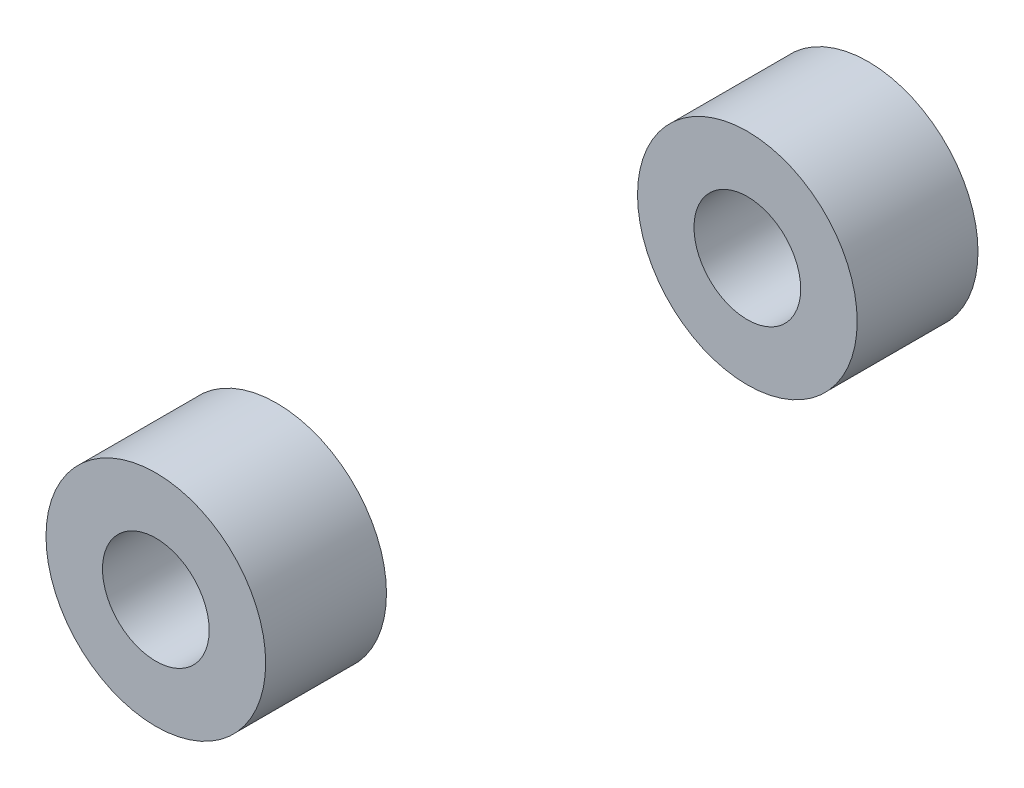
ISO-10303-21;
HEADER;
FILE_DESCRIPTION(('STEP AP214'),'2;1');
FILE_NAME('part.step','',(''),(''),'','','');
FILE_SCHEMA(('AUTOMOTIVE_DESIGN { 1 0 10303 214 1 1 1 1 }'));
ENDSEC;
DATA;
#1=APPLICATION_CONTEXT('core data for automotive mechanical design processes');
#2=APPLICATION_PROTOCOL_DEFINITION('international standard','automotive_design',2000,#1);
#3=PRODUCT_CONTEXT('',#1,'mechanical');
#4=PRODUCT('Part','Part','',(#3));
#5=PRODUCT_RELATED_PRODUCT_CATEGORY('part','',(#4));
#6=PRODUCT_DEFINITION_FORMATION('','',#4);
#7=PRODUCT_DEFINITION_CONTEXT('part definition',#1,'design');
#8=PRODUCT_DEFINITION('design','',#6,#7);
#9=PRODUCT_DEFINITION_SHAPE('','',#8);
#10=(LENGTH_UNIT() NAMED_UNIT(*) SI_UNIT(.MILLI.,.METRE.));
#11=(NAMED_UNIT(*) PLANE_ANGLE_UNIT() SI_UNIT($,.RADIAN.));
#12=(NAMED_UNIT(*) SI_UNIT($,.STERADIAN.) SOLID_ANGLE_UNIT());
#13=UNCERTAINTY_MEASURE_WITH_UNIT(LENGTH_MEASURE(1.E-05),#10,'distance_accuracy_value','');
#14=(GEOMETRIC_REPRESENTATION_CONTEXT(3) GLOBAL_UNCERTAINTY_ASSIGNED_CONTEXT((#13)) GLOBAL_UNIT_ASSIGNED_CONTEXT((#10,
#11,#12)) REPRESENTATION_CONTEXT('',''));
#15=CARTESIAN_POINT('',(0.,0.,0.));
#16=DIRECTION('',(0.,0.,1.));
#17=DIRECTION('',(1.,0.,0.));
#18=AXIS2_PLACEMENT_3D('',#15,#16,#17);
#19=CARTESIAN_POINT('',(0.,0.,22.7));
#20=DIRECTION('',(0.,0.,-1.));
#21=DIRECTION('',(-1.,0.,0.));
#22=AXIS2_PLACEMENT_3D('',#19,#20,#21);
#23=CYLINDRICAL_SURFACE('',#22,3.5);
#24=CARTESIAN_POINT('',(0.,0.,0.));
#25=DIRECTION('',(0.,0.,1.));
#26=DIRECTION('',(1.,0.,0.));
#27=AXIS2_PLACEMENT_3D('',#24,#25,#26);
#28=CIRCLE('',#27,3.5);
#29=CARTESIAN_POINT('',(3.5,0.,0.));
#30=VERTEX_POINT('',#29);
#31=EDGE_CURVE('E67',#30,#30,#28,.T.);
#32=ORIENTED_EDGE('',*,*,#31,.T.);
#33=EDGE_LOOP('',(#32));
#34=FACE_BOUND('',#33,.T.);
#35=CARTESIAN_POINT('',(0.,0.,3.85));
#36=DIRECTION('',(0.,0.,1.));
#37=DIRECTION('',(1.,0.,0.));
#38=AXIS2_PLACEMENT_3D('',#35,#36,#37);
#39=CIRCLE('',#38,3.5);
#40=CARTESIAN_POINT('',(3.5,0.,3.85));
#41=VERTEX_POINT('',#40);
#42=EDGE_CURVE('E11',#41,#41,#39,.T.);
#43=ORIENTED_EDGE('',*,*,#42,.F.);
#44=EDGE_LOOP('',(#43));
#45=FACE_BOUND('',#44,.T.);
#46=ADVANCED_FACE('F49',(#34,#45),#23,.T.);
#47=CARTESIAN_POINT('',(0.,0.,22.7));
#48=DIRECTION('',(0.,0.,-1.));
#49=DIRECTION('',(-1.,0.,0.));
#50=AXIS2_PLACEMENT_3D('',#47,#48,#49);
#51=CYLINDRICAL_SURFACE('',#50,1.7);
#52=CARTESIAN_POINT('',(0.,0.,0.));
#53=DIRECTION('',(0.,0.,1.));
#54=DIRECTION('',(1.,0.,0.));
#55=AXIS2_PLACEMENT_3D('',#52,#53,#54);
#56=CIRCLE('',#55,1.7);
#57=CARTESIAN_POINT('',(1.7,0.,0.));
#58=VERTEX_POINT('',#57);
#59=EDGE_CURVE('E57',#58,#58,#56,.T.);
#60=ORIENTED_EDGE('',*,*,#59,.F.);
#61=EDGE_LOOP('',(#60));
#62=FACE_BOUND('',#61,.T.);
#63=CARTESIAN_POINT('',(0.,0.,3.85));
#64=DIRECTION('',(0.,0.,1.));
#65=DIRECTION('',(1.,0.,0.));
#66=AXIS2_PLACEMENT_3D('',#63,#64,#65);
#67=CIRCLE('',#66,1.7);
#68=CARTESIAN_POINT('',(1.7,0.,3.85));
#69=VERTEX_POINT('',#68);
#70=EDGE_CURVE('E62',#69,#69,#67,.T.);
#71=ORIENTED_EDGE('',*,*,#70,.T.);
#72=EDGE_LOOP('',(#71));
#73=FACE_BOUND('',#72,.T.);
#74=ADVANCED_FACE('F51',(#62,#73),#51,.F.);
#75=CARTESIAN_POINT('',(0.,0.,0.));
#76=DIRECTION('',(0.,0.,1.));
#77=DIRECTION('',(1.,0.,0.));
#78=AXIS2_PLACEMENT_3D('',#75,#76,#77);
#79=PLANE('',#78);
#80=ORIENTED_EDGE('',*,*,#31,.F.);
#81=EDGE_LOOP('',(#80));
#82=FACE_BOUND('',#81,.T.);
#83=ORIENTED_EDGE('',*,*,#59,.T.);
#84=EDGE_LOOP('',(#83));
#85=FACE_BOUND('',#84,.T.);
#86=ADVANCED_FACE('F76',(#82,#85),#79,.F.);
#87=CARTESIAN_POINT('',(0.,0.,3.85));
#88=DIRECTION('',(0.,0.,1.));
#89=DIRECTION('',(1.,0.,0.));
#90=AXIS2_PLACEMENT_3D('',#87,#88,#89);
#91=PLANE('',#90);
#92=ORIENTED_EDGE('',*,*,#70,.F.);
#93=EDGE_LOOP('',(#92));
#94=FACE_BOUND('',#93,.T.);
#95=ORIENTED_EDGE('',*,*,#42,.T.);
#96=EDGE_LOOP('',(#95));
#97=FACE_BOUND('',#96,.T.);
#98=ADVANCED_FACE('F78',(#94,#97),#91,.T.);
#99=CLOSED_SHELL('',(#46,#74,#86,#98));
#100=MANIFOLD_SOLID_BREP('B2',#99);
#101=CARTESIAN_POINT('',(0.,0.,22.7));
#102=DIRECTION('',(0.,0.,-1.));
#103=DIRECTION('',(-1.,0.,0.));
#104=AXIS2_PLACEMENT_3D('',#101,#102,#103);
#105=CYLINDRICAL_SURFACE('',#104,3.5);
#106=CARTESIAN_POINT('',(0.,0.,18.85));
#107=DIRECTION('',(0.,0.,1.));
#108=DIRECTION('',(1.,0.,0.));
#109=AXIS2_PLACEMENT_3D('',#106,#107,#108);
#110=CIRCLE('',#109,3.5);
#111=CARTESIAN_POINT('',(3.5,0.,18.85));
#112=VERTEX_POINT('',#111);
#113=EDGE_CURVE('E136',#112,#112,#110,.T.);
#114=ORIENTED_EDGE('',*,*,#113,.T.);
#115=EDGE_LOOP('',(#114));
#116=FACE_BOUND('',#115,.T.);
#117=CARTESIAN_POINT('',(0.,0.,22.7));
#118=DIRECTION('',(0.,0.,1.));
#119=DIRECTION('',(1.,0.,0.));
#120=AXIS2_PLACEMENT_3D('',#117,#118,#119);
#121=CIRCLE('',#120,3.5);
#122=CARTESIAN_POINT('',(3.5,0.,22.7));
#123=VERTEX_POINT('',#122);
#124=EDGE_CURVE('E48',#123,#123,#121,.T.);
#125=ORIENTED_EDGE('',*,*,#124,.F.);
#126=EDGE_LOOP('',(#125));
#127=FACE_BOUND('',#126,.T.);
#128=ADVANCED_FACE('F123',(#116,#127),#105,.T.);
#129=CARTESIAN_POINT('',(0.,0.,22.7));
#130=DIRECTION('',(0.,0.,1.));
#131=DIRECTION('',(1.,0.,0.));
#132=AXIS2_PLACEMENT_3D('',#129,#130,#131);
#133=PLANE('',#132);
#134=ORIENTED_EDGE('',*,*,#124,.T.);
#135=EDGE_LOOP('',(#134));
#136=FACE_BOUND('',#135,.T.);
#137=CARTESIAN_POINT('',(0.,0.,22.7));
#138=DIRECTION('',(0.,0.,1.));
#139=DIRECTION('',(1.,0.,0.));
#140=AXIS2_PLACEMENT_3D('',#137,#138,#139);
#141=CIRCLE('',#140,1.7);
#142=CARTESIAN_POINT('',(1.7,0.,22.7));
#143=VERTEX_POINT('',#142);
#144=EDGE_CURVE('E130',#143,#143,#141,.T.);
#145=ORIENTED_EDGE('',*,*,#144,.F.);
#146=EDGE_LOOP('',(#145));
#147=FACE_BOUND('',#146,.T.);
#148=ADVANCED_FACE('F149',(#136,#147),#133,.T.);
#149=CARTESIAN_POINT('',(0.,0.,22.7));
#150=DIRECTION('',(0.,0.,-1.));
#151=DIRECTION('',(-1.,0.,0.));
#152=AXIS2_PLACEMENT_3D('',#149,#150,#151);
#153=CYLINDRICAL_SURFACE('',#152,1.7);
#154=CARTESIAN_POINT('',(0.,0.,18.85));
#155=DIRECTION('',(0.,0.,1.));
#156=DIRECTION('',(1.,0.,0.));
#157=AXIS2_PLACEMENT_3D('',#154,#155,#156);
#158=CIRCLE('',#157,1.7);
#159=CARTESIAN_POINT('',(1.7,0.,18.85));
#160=VERTEX_POINT('',#159);
#161=EDGE_CURVE('E126',#160,#160,#158,.T.);
#162=ORIENTED_EDGE('',*,*,#161,.F.);
#163=EDGE_LOOP('',(#162));
#164=FACE_BOUND('',#163,.T.);
#165=ORIENTED_EDGE('',*,*,#144,.T.);
#166=EDGE_LOOP('',(#165));
#167=FACE_BOUND('',#166,.T.);
#168=ADVANCED_FACE('F146',(#164,#167),#153,.F.);
#169=CARTESIAN_POINT('',(0.,0.,18.85));
#170=DIRECTION('',(0.,0.,1.));
#171=DIRECTION('',(1.,0.,0.));
#172=AXIS2_PLACEMENT_3D('',#169,#170,#171);
#173=PLANE('',#172);
#174=ORIENTED_EDGE('',*,*,#161,.T.);
#175=EDGE_LOOP('',(#174));
#176=FACE_BOUND('',#175,.T.);
#177=ORIENTED_EDGE('',*,*,#113,.F.);
#178=EDGE_LOOP('',(#177));
#179=FACE_BOUND('',#178,.T.);
#180=ADVANCED_FACE('F143',(#176,#179),#173,.F.);
#181=CLOSED_SHELL('',(#128,#148,#168,#180));
#182=MANIFOLD_SOLID_BREP('B6',#181);
#183=ADVANCED_BREP_SHAPE_REPRESENTATION('',(#18,#100,#182),#14);
#184=SHAPE_DEFINITION_REPRESENTATION(#9,#183);
ENDSEC;
END-ISO-10303-21;
